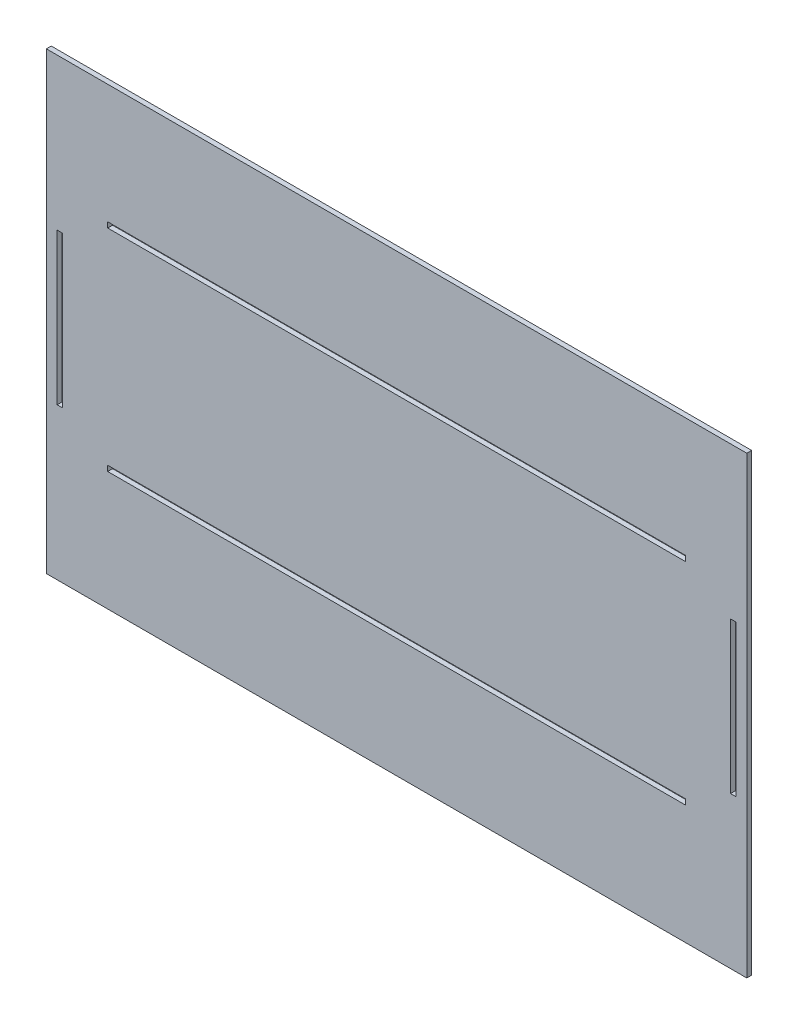
ISO-10303-21;
HEADER;
FILE_DESCRIPTION(('STEP AP214'),'2;1');
FILE_NAME('part.step','',(''),(''),'','','');
FILE_SCHEMA(('AUTOMOTIVE_DESIGN { 1 0 10303 214 1 1 1 1 }'));
ENDSEC;
DATA;
#1=APPLICATION_CONTEXT('core data for automotive mechanical design processes');
#2=APPLICATION_PROTOCOL_DEFINITION('international standard','automotive_design',2000,#1);
#3=PRODUCT_CONTEXT('',#1,'mechanical');
#4=PRODUCT('Part','Part','',(#3));
#5=PRODUCT_RELATED_PRODUCT_CATEGORY('part','',(#4));
#6=PRODUCT_DEFINITION_FORMATION('','',#4);
#7=PRODUCT_DEFINITION_CONTEXT('part definition',#1,'design');
#8=PRODUCT_DEFINITION('design','',#6,#7);
#9=PRODUCT_DEFINITION_SHAPE('','',#8);
#10=(LENGTH_UNIT() NAMED_UNIT(*) SI_UNIT(.MILLI.,.METRE.));
#11=(NAMED_UNIT(*) PLANE_ANGLE_UNIT() SI_UNIT($,.RADIAN.));
#12=(NAMED_UNIT(*) SI_UNIT($,.STERADIAN.) SOLID_ANGLE_UNIT());
#13=UNCERTAINTY_MEASURE_WITH_UNIT(LENGTH_MEASURE(1.E-05),#10,'distance_accuracy_value','');
#14=(GEOMETRIC_REPRESENTATION_CONTEXT(3) GLOBAL_UNCERTAINTY_ASSIGNED_CONTEXT((#13)) GLOBAL_UNIT_ASSIGNED_CONTEXT((#10,
#11,#12)) REPRESENTATION_CONTEXT('',''));
#15=CARTESIAN_POINT('',(0.,0.,0.));
#16=DIRECTION('',(0.,0.,1.));
#17=DIRECTION('',(1.,0.,0.));
#18=AXIS2_PLACEMENT_3D('',#15,#16,#17);
#19=CARTESIAN_POINT('',(313.36742,0.,2.286));
#20=DIRECTION('',(1.,0.,0.));
#21=DIRECTION('',(0.,0.,-1.));
#22=AXIS2_PLACEMENT_3D('',#19,#20,#21);
#23=PLANE('',#22);
#24=DIRECTION('',(0.,-1.,0.));
#25=VECTOR('',#24,1.);
#26=CARTESIAN_POINT('',(313.36742,0.,0.));
#27=LINE('',#26,#25);
#28=CARTESIAN_POINT('',(313.36742,83.6803,0.));
#29=VERTEX_POINT('',#28);
#30=CARTESIAN_POINT('',(313.36742,12.7,0.));
#31=VERTEX_POINT('',#30);
#32=EDGE_CURVE('E302',#29,#31,#27,.T.);
#33=ORIENTED_EDGE('',*,*,#32,.F.);
#34=DIRECTION('',(0.,0.,-1.));
#35=VECTOR('',#34,1.);
#36=CARTESIAN_POINT('',(313.36742,83.6803,2.286));
#37=LINE('',#36,#35);
#38=CARTESIAN_POINT('',(313.36742,83.6803,2.286));
#39=VERTEX_POINT('',#38);
#40=EDGE_CURVE('E11',#39,#29,#37,.T.);
#41=ORIENTED_EDGE('',*,*,#40,.F.);
#42=DIRECTION('',(0.,-1.,0.));
#43=VECTOR('',#42,1.);
#44=CARTESIAN_POINT('',(313.36742,0.,2.286));
#45=LINE('',#44,#43);
#46=CARTESIAN_POINT('',(313.36742,12.7,2.286));
#47=VERTEX_POINT('',#46);
#48=EDGE_CURVE('E182',#39,#47,#45,.T.);
#49=ORIENTED_EDGE('',*,*,#48,.T.);
#50=DIRECTION('',(0.,0.,-1.));
#51=VECTOR('',#50,1.);
#52=CARTESIAN_POINT('',(313.36742,12.7,2.286));
#53=LINE('',#52,#51);
#54=EDGE_CURVE('E120',#47,#31,#53,.T.);
#55=ORIENTED_EDGE('',*,*,#54,.T.);
#56=EDGE_LOOP('',(#33,#41,#49,#55));
#57=FACE_BOUND('',#56,.T.);
#58=ADVANCED_FACE('F41',(#57),#23,.T.);
#59=CARTESIAN_POINT('',(0.,83.6803,2.286));
#60=DIRECTION('',(0.,1.,0.));
#61=DIRECTION('',(0.,0.,1.));
#62=AXIS2_PLACEMENT_3D('',#59,#60,#61);
#63=PLANE('',#62);
#64=DIRECTION('',(1.,0.,0.));
#65=VECTOR('',#64,1.);
#66=CARTESIAN_POINT('',(0.,83.6803,0.));
#67=LINE('',#66,#65);
#68=CARTESIAN_POINT('',(315.90742,83.6803,0.));
#69=VERTEX_POINT('',#68);
#70=EDGE_CURVE('E188',#29,#69,#67,.T.);
#71=ORIENTED_EDGE('',*,*,#70,.T.);
#72=DIRECTION('',(0.,0.,-1.));
#73=VECTOR('',#72,1.);
#74=CARTESIAN_POINT('',(315.90742,83.6803,2.286));
#75=LINE('',#74,#73);
#76=CARTESIAN_POINT('',(315.90742,83.6803,2.286));
#77=VERTEX_POINT('',#76);
#78=EDGE_CURVE('E52',#77,#69,#75,.T.);
#79=ORIENTED_EDGE('',*,*,#78,.F.);
#80=DIRECTION('',(1.,0.,0.));
#81=VECTOR('',#80,1.);
#82=CARTESIAN_POINT('',(0.,83.6803,2.286));
#83=LINE('',#82,#81);
#84=EDGE_CURVE('E178',#39,#77,#83,.T.);
#85=ORIENTED_EDGE('',*,*,#84,.F.);
#86=ORIENTED_EDGE('',*,*,#40,.T.);
#87=EDGE_LOOP('',(#71,#79,#85,#86));
#88=FACE_BOUND('',#87,.T.);
#89=ADVANCED_FACE('F186',(#88),#63,.F.);
#90=CARTESIAN_POINT('',(315.90742,0.,2.286));
#91=DIRECTION('',(1.,0.,0.));
#92=DIRECTION('',(0.,0.,-1.));
#93=AXIS2_PLACEMENT_3D('',#90,#91,#92);
#94=PLANE('',#93);
#95=DIRECTION('',(0.,-1.,0.));
#96=VECTOR('',#95,1.);
#97=CARTESIAN_POINT('',(315.90742,0.,0.));
#98=LINE('',#97,#96);
#99=CARTESIAN_POINT('',(315.90742,12.7,0.));
#100=VERTEX_POINT('',#99);
#101=EDGE_CURVE('E307',#69,#100,#98,.T.);
#102=ORIENTED_EDGE('',*,*,#101,.T.);
#103=DIRECTION('',(0.,0.,-1.));
#104=VECTOR('',#103,1.);
#105=CARTESIAN_POINT('',(315.90742,12.7,2.286));
#106=LINE('',#105,#104);
#107=CARTESIAN_POINT('',(315.90742,12.7,2.286));
#108=VERTEX_POINT('',#107);
#109=EDGE_CURVE('E176',#108,#100,#106,.T.);
#110=ORIENTED_EDGE('',*,*,#109,.F.);
#111=DIRECTION('',(0.,-1.,0.));
#112=VECTOR('',#111,1.);
#113=CARTESIAN_POINT('',(315.90742,0.,2.286));
#114=LINE('',#113,#112);
#115=EDGE_CURVE('E170',#77,#108,#114,.T.);
#116=ORIENTED_EDGE('',*,*,#115,.F.);
#117=ORIENTED_EDGE('',*,*,#78,.T.);
#118=EDGE_LOOP('',(#102,#110,#116,#117));
#119=FACE_BOUND('',#118,.T.);
#120=ADVANCED_FACE('F173',(#119),#94,.F.);
#121=CARTESIAN_POINT('',(0.,98.9203,2.286));
#122=DIRECTION('',(0.,1.,0.));
#123=DIRECTION('',(0.,0.,1.));
#124=AXIS2_PLACEMENT_3D('',#121,#122,#123);
#125=PLANE('',#124);
#126=DIRECTION('',(1.,0.,0.));
#127=VECTOR('',#126,1.);
#128=CARTESIAN_POINT('',(0.,98.9203,0.));
#129=LINE('',#128,#127);
#130=CARTESIAN_POINT('',(21.166832765993,98.9203,0.));
#131=VERTEX_POINT('',#130);
#132=CARTESIAN_POINT('',(292.200587234007,98.9203,0.));
#133=VERTEX_POINT('',#132);
#134=EDGE_CURVE('E286',#131,#133,#129,.T.);
#135=ORIENTED_EDGE('',*,*,#134,.T.);
#136=DIRECTION('',(0.,0.,-1.));
#137=VECTOR('',#136,1.);
#138=CARTESIAN_POINT('',(292.200587234007,98.9203,2.286));
#139=LINE('',#138,#137);
#140=CARTESIAN_POINT('',(292.200587234007,98.9203,2.286));
#141=VERTEX_POINT('',#140);
#142=EDGE_CURVE('E205',#141,#133,#139,.T.);
#143=ORIENTED_EDGE('',*,*,#142,.F.);
#144=DIRECTION('',(1.,0.,0.));
#145=VECTOR('',#144,1.);
#146=CARTESIAN_POINT('',(0.,98.9203,2.286));
#147=LINE('',#146,#145);
#148=CARTESIAN_POINT('',(21.166832765993,98.9203,2.286));
#149=VERTEX_POINT('',#148);
#150=EDGE_CURVE('E351',#149,#141,#147,.T.);
#151=ORIENTED_EDGE('',*,*,#150,.F.);
#152=DIRECTION('',(0.,0.,-1.));
#153=VECTOR('',#152,1.);
#154=CARTESIAN_POINT('',(21.166832765993,98.9203,2.286));
#155=LINE('',#154,#153);
#156=EDGE_CURVE('E195',#149,#131,#155,.T.);
#157=ORIENTED_EDGE('',*,*,#156,.T.);
#158=EDGE_LOOP('',(#135,#143,#151,#157));
#159=FACE_BOUND('',#158,.T.);
#160=ADVANCED_FACE('F404',(#159),#125,.F.);
#161=CARTESIAN_POINT('',(292.200587234007,0.,2.286));
#162=DIRECTION('',(1.,0.,0.));
#163=DIRECTION('',(0.,0.,-1.));
#164=AXIS2_PLACEMENT_3D('',#161,#162,#163);
#165=PLANE('',#164);
#166=DIRECTION('',(0.,-1.,0.));
#167=VECTOR('',#166,1.);
#168=CARTESIAN_POINT('',(292.200587234007,0.,0.));
#169=LINE('',#168,#167);
#170=CARTESIAN_POINT('',(292.200587234007,96.3803,0.));
#171=VERTEX_POINT('',#170);
#172=EDGE_CURVE('E290',#133,#171,#169,.T.);
#173=ORIENTED_EDGE('',*,*,#172,.T.);
#174=DIRECTION('',(0.,0.,-1.));
#175=VECTOR('',#174,1.);
#176=CARTESIAN_POINT('',(292.200587234007,96.3803,2.286));
#177=LINE('',#176,#175);
#178=CARTESIAN_POINT('',(292.200587234007,96.3803,2.286));
#179=VERTEX_POINT('',#178);
#180=EDGE_CURVE('E202',#179,#171,#177,.T.);
#181=ORIENTED_EDGE('',*,*,#180,.F.);
#182=DIRECTION('',(0.,-1.,0.));
#183=VECTOR('',#182,1.);
#184=CARTESIAN_POINT('',(292.200587234007,0.,2.286));
#185=LINE('',#184,#183);
#186=EDGE_CURVE('E355',#141,#179,#185,.T.);
#187=ORIENTED_EDGE('',*,*,#186,.F.);
#188=ORIENTED_EDGE('',*,*,#142,.T.);
#189=EDGE_LOOP('',(#173,#181,#187,#188));
#190=FACE_BOUND('',#189,.T.);
#191=ADVANCED_FACE('F400',(#190),#165,.F.);
#192=CARTESIAN_POINT('',(0.,96.3803,2.286));
#193=DIRECTION('',(0.,1.,0.));
#194=DIRECTION('',(0.,0.,1.));
#195=AXIS2_PLACEMENT_3D('',#192,#193,#194);
#196=PLANE('',#195);
#197=DIRECTION('',(1.,0.,0.));
#198=VECTOR('',#197,1.);
#199=CARTESIAN_POINT('',(0.,96.3803,0.));
#200=LINE('',#199,#198);
#201=CARTESIAN_POINT('',(21.166832765993,96.3803,0.));
#202=VERTEX_POINT('',#201);
#203=EDGE_CURVE('E294',#202,#171,#200,.T.);
#204=ORIENTED_EDGE('',*,*,#203,.F.);
#205=DIRECTION('',(0.,0.,-1.));
#206=VECTOR('',#205,1.);
#207=CARTESIAN_POINT('',(21.166832765993,96.3803,2.286));
#208=LINE('',#207,#206);
#209=CARTESIAN_POINT('',(21.166832765993,96.3803,2.286));
#210=VERTEX_POINT('',#209);
#211=EDGE_CURVE('E198',#210,#202,#208,.T.);
#212=ORIENTED_EDGE('',*,*,#211,.F.);
#213=DIRECTION('',(1.,0.,0.));
#214=VECTOR('',#213,1.);
#215=CARTESIAN_POINT('',(0.,96.3803,2.286));
#216=LINE('',#215,#214);
#217=EDGE_CURVE('E358',#210,#179,#216,.T.);
#218=ORIENTED_EDGE('',*,*,#217,.T.);
#219=ORIENTED_EDGE('',*,*,#180,.T.);
#220=EDGE_LOOP('',(#204,#212,#218,#219));
#221=FACE_BOUND('',#220,.T.);
#222=ADVANCED_FACE('F396',(#221),#196,.T.);
#223=CARTESIAN_POINT('',(0.,0.,2.286));
#224=DIRECTION('',(0.,1.,0.));
#225=DIRECTION('',(0.,0.,1.));
#226=AXIS2_PLACEMENT_3D('',#223,#224,#225);
#227=PLANE('',#226);
#228=DIRECTION('',(1.,0.,0.));
#229=VECTOR('',#228,1.);
#230=CARTESIAN_POINT('',(0.,0.,0.));
#231=LINE('',#230,#229);
#232=CARTESIAN_POINT('',(21.166832765993,0.,0.));
#233=VERTEX_POINT('',#232);
#234=CARTESIAN_POINT('',(292.200587234007,0.,0.));
#235=VERTEX_POINT('',#234);
#236=EDGE_CURVE('E270',#233,#235,#231,.T.);
#237=ORIENTED_EDGE('',*,*,#236,.T.);
#238=DIRECTION('',(0.,0.,-1.));
#239=VECTOR('',#238,1.);
#240=CARTESIAN_POINT('',(292.200587234007,0.,2.286));
#241=LINE('',#240,#239);
#242=CARTESIAN_POINT('',(292.200587234007,0.,2.286));
#243=VERTEX_POINT('',#242);
#244=EDGE_CURVE('E199',#243,#235,#241,.T.);
#245=ORIENTED_EDGE('',*,*,#244,.F.);
#246=DIRECTION('',(1.,0.,0.));
#247=VECTOR('',#246,1.);
#248=CARTESIAN_POINT('',(0.,0.,2.286));
#249=LINE('',#248,#247);
#250=CARTESIAN_POINT('',(21.166832765993,0.,2.286));
#251=VERTEX_POINT('',#250);
#252=EDGE_CURVE('E336',#251,#243,#249,.T.);
#253=ORIENTED_EDGE('',*,*,#252,.F.);
#254=DIRECTION('',(0.,0.,-1.));
#255=VECTOR('',#254,1.);
#256=CARTESIAN_POINT('',(21.166832765993,0.,2.286));
#257=LINE('',#256,#255);
#258=EDGE_CURVE('E209',#251,#233,#257,.T.);
#259=ORIENTED_EDGE('',*,*,#258,.T.);
#260=EDGE_LOOP('',(#237,#245,#253,#259));
#261=FACE_BOUND('',#260,.T.);
#262=ADVANCED_FACE('F399',(#261),#227,.F.);
#263=CARTESIAN_POINT('',(292.200587234007,0.,2.286));
#264=DIRECTION('',(1.,0.,0.));
#265=DIRECTION('',(0.,0.,-1.));
#266=AXIS2_PLACEMENT_3D('',#263,#264,#265);
#267=PLANE('',#266);
#268=DIRECTION('',(0.,-1.,0.));
#269=VECTOR('',#268,1.);
#270=CARTESIAN_POINT('',(292.200587234007,0.,0.));
#271=LINE('',#270,#269);
#272=CARTESIAN_POINT('',(292.200587234007,-2.54,0.));
#273=VERTEX_POINT('',#272);
#274=EDGE_CURVE('E274',#235,#273,#271,.T.);
#275=ORIENTED_EDGE('',*,*,#274,.T.);
#276=DIRECTION('',(0.,0.,-1.));
#277=VECTOR('',#276,1.);
#278=CARTESIAN_POINT('',(292.200587234007,-2.54,2.286));
#279=LINE('',#278,#277);
#280=CARTESIAN_POINT('',(292.200587234007,-2.54,2.286));
#281=VERTEX_POINT('',#280);
#282=EDGE_CURVE('E215',#281,#273,#279,.T.);
#283=ORIENTED_EDGE('',*,*,#282,.F.);
#284=DIRECTION('',(0.,-1.,0.));
#285=VECTOR('',#284,1.);
#286=CARTESIAN_POINT('',(292.200587234007,0.,2.286));
#287=LINE('',#286,#285);
#288=EDGE_CURVE('E340',#243,#281,#287,.T.);
#289=ORIENTED_EDGE('',*,*,#288,.F.);
#290=ORIENTED_EDGE('',*,*,#244,.T.);
#291=EDGE_LOOP('',(#275,#283,#289,#290));
#292=FACE_BOUND('',#291,.T.);
#293=ADVANCED_FACE('F417',(#292),#267,.F.);
#294=CARTESIAN_POINT('',(0.,-2.54,2.286));
#295=DIRECTION('',(0.,1.,0.));
#296=DIRECTION('',(0.,0.,1.));
#297=AXIS2_PLACEMENT_3D('',#294,#295,#296);
#298=PLANE('',#297);
#299=DIRECTION('',(1.,0.,0.));
#300=VECTOR('',#299,1.);
#301=CARTESIAN_POINT('',(0.,-2.54,0.));
#302=LINE('',#301,#300);
#303=CARTESIAN_POINT('',(21.166832765993,-2.54,0.));
#304=VERTEX_POINT('',#303);
#305=EDGE_CURVE('E278',#304,#273,#302,.T.);
#306=ORIENTED_EDGE('',*,*,#305,.F.);
#307=DIRECTION('',(0.,0.,-1.));
#308=VECTOR('',#307,1.);
#309=CARTESIAN_POINT('',(21.166832765993,-2.54,2.286));
#310=LINE('',#309,#308);
#311=CARTESIAN_POINT('',(21.166832765993,-2.54,2.286));
#312=VERTEX_POINT('',#311);
#313=EDGE_CURVE('E212',#312,#304,#310,.T.);
#314=ORIENTED_EDGE('',*,*,#313,.F.);
#315=DIRECTION('',(1.,0.,0.));
#316=VECTOR('',#315,1.);
#317=CARTESIAN_POINT('',(0.,-2.54,2.286));
#318=LINE('',#317,#316);
#319=EDGE_CURVE('E343',#312,#281,#318,.T.);
#320=ORIENTED_EDGE('',*,*,#319,.T.);
#321=ORIENTED_EDGE('',*,*,#282,.T.);
#322=EDGE_LOOP('',(#306,#314,#320,#321));
#323=FACE_BOUND('',#322,.T.);
#324=ADVANCED_FACE('F413',(#323),#298,.T.);
#325=CARTESIAN_POINT('',(-7.62,0.,2.286));
#326=DIRECTION('',(-1.,0.,0.));
#327=DIRECTION('',(0.,0.,1.));
#328=AXIS2_PLACEMENT_3D('',#325,#326,#327);
#329=PLANE('',#328);
#330=DIRECTION('',(0.,1.,0.));
#331=VECTOR('',#330,1.);
#332=CARTESIAN_POINT('',(-7.62,0.,0.));
#333=LINE('',#332,#331);
#334=CARTESIAN_POINT('',(-7.61999999999998,-58.42,0.));
#335=VERTEX_POINT('',#334);
#336=CARTESIAN_POINT('',(-7.62,154.8003,0.));
#337=VERTEX_POINT('',#336);
#338=EDGE_CURVE('E262',#335,#337,#333,.T.);
#339=ORIENTED_EDGE('',*,*,#338,.F.);
#340=DIRECTION('',(0.,0.,1.));
#341=VECTOR('',#340,1.);
#342=CARTESIAN_POINT('',(-7.61999999999998,-58.42,0.));
#343=LINE('',#342,#341);
#344=CARTESIAN_POINT('',(-7.61999999999998,-58.42,2.286));
#345=VERTEX_POINT('',#344);
#346=EDGE_CURVE('E598',#335,#345,#343,.T.);
#347=ORIENTED_EDGE('',*,*,#346,.T.);
#348=DIRECTION('',(0.,1.,0.));
#349=VECTOR('',#348,1.);
#350=CARTESIAN_POINT('',(-7.62,0.,2.286));
#351=LINE('',#350,#349);
#352=CARTESIAN_POINT('',(-7.62,154.8003,2.286));
#353=VERTEX_POINT('',#352);
#354=EDGE_CURVE('E328',#345,#353,#351,.T.);
#355=ORIENTED_EDGE('',*,*,#354,.T.);
#356=DIRECTION('',(0.,0.,1.));
#357=VECTOR('',#356,1.);
#358=CARTESIAN_POINT('',(-7.62,154.8003,0.));
#359=LINE('',#358,#357);
#360=EDGE_CURVE('E248',#337,#353,#359,.T.);
#361=ORIENTED_EDGE('',*,*,#360,.F.);
#362=EDGE_LOOP('',(#339,#347,#355,#361));
#363=FACE_BOUND('',#362,.T.);
#364=ADVANCED_FACE('F416',(#363),#329,.T.);
#365=CARTESIAN_POINT('',(320.98742,0.,2.286));
#366=DIRECTION('',(-1.,0.,0.));
#367=DIRECTION('',(0.,0.,1.));
#368=AXIS2_PLACEMENT_3D('',#365,#366,#367);
#369=PLANE('',#368);
#370=DIRECTION('',(0.,1.,0.));
#371=VECTOR('',#370,1.);
#372=CARTESIAN_POINT('',(320.98742,0.,0.));
#373=LINE('',#372,#371);
#374=CARTESIAN_POINT('',(320.98742,-58.42,0.));
#375=VERTEX_POINT('',#374);
#376=CARTESIAN_POINT('',(320.98742,154.8003,0.));
#377=VERTEX_POINT('',#376);
#378=EDGE_CURVE('E266',#375,#377,#373,.T.);
#379=ORIENTED_EDGE('',*,*,#378,.T.);
#380=DIRECTION('',(0.,0.,1.));
#381=VECTOR('',#380,1.);
#382=CARTESIAN_POINT('',(320.98742,154.8003,0.));
#383=LINE('',#382,#381);
#384=CARTESIAN_POINT('',(320.98742,154.8003,2.286));
#385=VERTEX_POINT('',#384);
#386=EDGE_CURVE('E320',#377,#385,#383,.T.);
#387=ORIENTED_EDGE('',*,*,#386,.T.);
#388=DIRECTION('',(0.,1.,0.));
#389=VECTOR('',#388,1.);
#390=CARTESIAN_POINT('',(320.98742,0.,2.286));
#391=LINE('',#390,#389);
#392=CARTESIAN_POINT('',(320.98742,-58.42,2.286));
#393=VERTEX_POINT('',#392);
#394=EDGE_CURVE('E332',#393,#385,#391,.T.);
#395=ORIENTED_EDGE('',*,*,#394,.F.);
#396=DIRECTION('',(0.,0.,1.));
#397=VECTOR('',#396,1.);
#398=CARTESIAN_POINT('',(320.98742,-58.42,0.));
#399=LINE('',#398,#397);
#400=EDGE_CURVE('E602',#375,#393,#399,.T.);
#401=ORIENTED_EDGE('',*,*,#400,.F.);
#402=EDGE_LOOP('',(#379,#387,#395,#401));
#403=FACE_BOUND('',#402,.T.);
#404=ADVANCED_FACE('F425',(#403),#369,.F.);
#405=CARTESIAN_POINT('',(0.,12.7,2.286));
#406=DIRECTION('',(0.,1.,0.));
#407=DIRECTION('',(-1.,0.,0.));
#408=AXIS2_PLACEMENT_3D('',#405,#406,#407);
#409=PLANE('',#408);
#410=DIRECTION('',(1.,0.,0.));
#411=VECTOR('',#410,1.);
#412=CARTESIAN_POINT('',(0.,12.7,0.));
#413=LINE('',#412,#411);
#414=CARTESIAN_POINT('',(-2.53999999999999,12.7,0.));
#415=VERTEX_POINT('',#414);
#416=CARTESIAN_POINT('',(0.,12.7,0.));
#417=VERTEX_POINT('',#416);
#418=EDGE_CURVE('E242',#415,#417,#413,.T.);
#419=ORIENTED_EDGE('',*,*,#418,.F.);
#420=DIRECTION('',(0.,0.,-1.));
#421=VECTOR('',#420,1.);
#422=CARTESIAN_POINT('',(-2.53999999999999,12.7,2.286));
#423=LINE('',#422,#421);
#424=CARTESIAN_POINT('',(-2.53999999999999,12.7,2.286));
#425=VERTEX_POINT('',#424);
#426=EDGE_CURVE('E45',#425,#415,#423,.T.);
#427=ORIENTED_EDGE('',*,*,#426,.F.);
#428=DIRECTION('',(1.,0.,0.));
#429=VECTOR('',#428,1.);
#430=CARTESIAN_POINT('',(0.,12.7,2.286));
#431=LINE('',#430,#429);
#432=CARTESIAN_POINT('',(0.,12.7,2.286));
#433=VERTEX_POINT('',#432);
#434=EDGE_CURVE('E311',#425,#433,#431,.T.);
#435=ORIENTED_EDGE('',*,*,#434,.T.);
#436=DIRECTION('',(0.,0.,-1.));
#437=VECTOR('',#436,1.);
#438=CARTESIAN_POINT('',(0.,12.7,2.286));
#439=LINE('',#438,#437);
#440=EDGE_CURVE('E221',#433,#417,#439,.T.);
#441=ORIENTED_EDGE('',*,*,#440,.T.);
#442=EDGE_LOOP('',(#419,#427,#435,#441));
#443=FACE_BOUND('',#442,.T.);
#444=ADVANCED_FACE('F43',(#443),#409,.T.);
#445=CARTESIAN_POINT('',(-2.53999999999999,0.,2.286));
#446=DIRECTION('',(1.,0.,0.));
#447=DIRECTION('',(0.,1.,0.));
#448=AXIS2_PLACEMENT_3D('',#445,#446,#447);
#449=PLANE('',#448);
#450=DIRECTION('',(0.,-1.,0.));
#451=VECTOR('',#450,1.);
#452=CARTESIAN_POINT('',(-2.53999999999999,0.,0.));
#453=LINE('',#452,#451);
#454=CARTESIAN_POINT('',(-2.54,83.6803,0.));
#455=VERTEX_POINT('',#454);
#456=EDGE_CURVE('E237',#455,#415,#453,.T.);
#457=ORIENTED_EDGE('',*,*,#456,.F.);
#458=DIRECTION('',(0.,0.,-1.));
#459=VECTOR('',#458,1.);
#460=CARTESIAN_POINT('',(-2.54,83.6803,2.286));
#461=LINE('',#460,#459);
#462=CARTESIAN_POINT('',(-2.54,83.6803,2.286));
#463=VERTEX_POINT('',#462);
#464=EDGE_CURVE('E226',#463,#455,#461,.T.);
#465=ORIENTED_EDGE('',*,*,#464,.F.);
#466=DIRECTION('',(0.,-1.,0.));
#467=VECTOR('',#466,1.);
#468=CARTESIAN_POINT('',(-2.53999999999999,0.,2.286));
#469=LINE('',#468,#467);
#470=EDGE_CURVE('E240',#463,#425,#469,.T.);
#471=ORIENTED_EDGE('',*,*,#470,.T.);
#472=ORIENTED_EDGE('',*,*,#426,.T.);
#473=EDGE_LOOP('',(#457,#465,#471,#472));
#474=FACE_BOUND('',#473,.T.);
#475=ADVANCED_FACE('F235',(#474),#449,.T.);
#476=CARTESIAN_POINT('',(0.,83.6803,2.286));
#477=DIRECTION('',(0.,-1.,0.));
#478=DIRECTION('',(0.,0.,-1.));
#479=AXIS2_PLACEMENT_3D('',#476,#477,#478);
#480=PLANE('',#479);
#481=DIRECTION('',(-1.,0.,0.));
#482=VECTOR('',#481,1.);
#483=CARTESIAN_POINT('',(0.,83.6803,0.));
#484=LINE('',#483,#482);
#485=CARTESIAN_POINT('',(0.,83.6803,0.));
#486=VERTEX_POINT('',#485);
#487=EDGE_CURVE('E252',#486,#455,#484,.T.);
#488=ORIENTED_EDGE('',*,*,#487,.F.);
#489=DIRECTION('',(0.,0.,-1.));
#490=VECTOR('',#489,1.);
#491=CARTESIAN_POINT('',(0.,83.6803,2.286));
#492=LINE('',#491,#490);
#493=CARTESIAN_POINT('',(0.,83.6803,2.286));
#494=VERTEX_POINT('',#493);
#495=EDGE_CURVE('E224',#494,#486,#492,.T.);
#496=ORIENTED_EDGE('',*,*,#495,.F.);
#497=DIRECTION('',(-1.,0.,0.));
#498=VECTOR('',#497,1.);
#499=CARTESIAN_POINT('',(0.,83.6803,2.286));
#500=LINE('',#499,#498);
#501=EDGE_CURVE('E317',#494,#463,#500,.T.);
#502=ORIENTED_EDGE('',*,*,#501,.T.);
#503=ORIENTED_EDGE('',*,*,#464,.T.);
#504=EDGE_LOOP('',(#488,#496,#502,#503));
#505=FACE_BOUND('',#504,.T.);
#506=ADVANCED_FACE('F394',(#505),#480,.T.);
#507=CARTESIAN_POINT('',(21.166832765993,0.,2.286));
#508=DIRECTION('',(1.,0.,0.));
#509=DIRECTION('',(0.,0.,-1.));
#510=AXIS2_PLACEMENT_3D('',#507,#508,#509);
#511=PLANE('',#510);
#512=DIRECTION('',(0.,-1.,0.));
#513=VECTOR('',#512,1.);
#514=CARTESIAN_POINT('',(21.166832765993,0.,0.));
#515=LINE('',#514,#513);
#516=EDGE_CURVE('E298',#131,#202,#515,.T.);
#517=ORIENTED_EDGE('',*,*,#516,.F.);
#518=ORIENTED_EDGE('',*,*,#156,.F.);
#519=DIRECTION('',(0.,-1.,0.));
#520=VECTOR('',#519,1.);
#521=CARTESIAN_POINT('',(21.166832765993,0.,2.286));
#522=LINE('',#521,#520);
#523=EDGE_CURVE('E362',#149,#210,#522,.T.);
#524=ORIENTED_EDGE('',*,*,#523,.T.);
#525=ORIENTED_EDGE('',*,*,#211,.T.);
#526=EDGE_LOOP('',(#517,#518,#524,#525));
#527=FACE_BOUND('',#526,.T.);
#528=ADVANCED_FACE('F390',(#527),#511,.T.);
#529=CARTESIAN_POINT('',(21.166832765993,0.,2.286));
#530=DIRECTION('',(1.,0.,0.));
#531=DIRECTION('',(0.,0.,-1.));
#532=AXIS2_PLACEMENT_3D('',#529,#530,#531);
#533=PLANE('',#532);
#534=DIRECTION('',(0.,-1.,0.));
#535=VECTOR('',#534,1.);
#536=CARTESIAN_POINT('',(21.166832765993,0.,0.));
#537=LINE('',#536,#535);
#538=EDGE_CURVE('E282',#233,#304,#537,.T.);
#539=ORIENTED_EDGE('',*,*,#538,.F.);
#540=ORIENTED_EDGE('',*,*,#258,.F.);
#541=DIRECTION('',(0.,-1.,0.));
#542=VECTOR('',#541,1.);
#543=CARTESIAN_POINT('',(21.166832765993,0.,2.286));
#544=LINE('',#543,#542);
#545=EDGE_CURVE('E347',#251,#312,#544,.T.);
#546=ORIENTED_EDGE('',*,*,#545,.T.);
#547=ORIENTED_EDGE('',*,*,#313,.T.);
#548=EDGE_LOOP('',(#539,#540,#546,#547));
#549=FACE_BOUND('',#548,.T.);
#550=ADVANCED_FACE('F393',(#549),#533,.T.);
#551=CARTESIAN_POINT('',(0.,0.,2.286));
#552=DIRECTION('',(1.,0.,0.));
#553=DIRECTION('',(0.,1.,0.));
#554=AXIS2_PLACEMENT_3D('',#551,#552,#553);
#555=PLANE('',#554);
#556=DIRECTION('',(0.,-1.,0.));
#557=VECTOR('',#556,1.);
#558=CARTESIAN_POINT('',(0.,0.,0.));
#559=LINE('',#558,#557);
#560=EDGE_CURVE('E256',#486,#417,#559,.T.);
#561=ORIENTED_EDGE('',*,*,#560,.T.);
#562=ORIENTED_EDGE('',*,*,#440,.F.);
#563=DIRECTION('',(0.,-1.,0.));
#564=VECTOR('',#563,1.);
#565=CARTESIAN_POINT('',(0.,0.,2.286));
#566=LINE('',#565,#564);
#567=EDGE_CURVE('E325',#494,#433,#566,.T.);
#568=ORIENTED_EDGE('',*,*,#567,.F.);
#569=ORIENTED_EDGE('',*,*,#495,.T.);
#570=EDGE_LOOP('',(#561,#562,#568,#569));
#571=FACE_BOUND('',#570,.T.);
#572=ADVANCED_FACE('F411',(#571),#555,.F.);
#573=CARTESIAN_POINT('',(0.,12.7000000000002,2.286));
#574=DIRECTION('',(0.,-1.,0.));
#575=DIRECTION('',(1.,0.,0.));
#576=AXIS2_PLACEMENT_3D('',#573,#574,#575);
#577=PLANE('',#576);
#578=DIRECTION('',(-1.,0.,0.));
#579=VECTOR('',#578,1.);
#580=CARTESIAN_POINT('',(0.,12.7000000000002,0.));
#581=LINE('',#580,#579);
#582=EDGE_CURVE('E113',#100,#31,#581,.T.);
#583=ORIENTED_EDGE('',*,*,#582,.T.);
#584=ORIENTED_EDGE('',*,*,#54,.F.);
#585=DIRECTION('',(-1.,0.,0.));
#586=VECTOR('',#585,1.);
#587=CARTESIAN_POINT('',(0.,12.7000000000002,2.286));
#588=LINE('',#587,#586);
#589=EDGE_CURVE('E61',#108,#47,#588,.T.);
#590=ORIENTED_EDGE('',*,*,#589,.F.);
#591=ORIENTED_EDGE('',*,*,#109,.T.);
#592=EDGE_LOOP('',(#583,#584,#590,#591));
#593=FACE_BOUND('',#592,.T.);
#594=ADVANCED_FACE('F378',(#593),#577,.F.);
#595=CARTESIAN_POINT('',(0.,0.,2.286));
#596=DIRECTION('',(0.,0.,1.));
#597=DIRECTION('',(1.,0.,0.));
#598=AXIS2_PLACEMENT_3D('',#595,#596,#597);
#599=PLANE('',#598);
#600=ORIENTED_EDGE('',*,*,#434,.F.);
#601=ORIENTED_EDGE('',*,*,#470,.F.);
#602=ORIENTED_EDGE('',*,*,#501,.F.);
#603=ORIENTED_EDGE('',*,*,#567,.T.);
#604=EDGE_LOOP('',(#600,#601,#602,#603));
#605=FACE_BOUND('',#604,.T.);
#606=ORIENTED_EDGE('',*,*,#354,.F.);
#607=DIRECTION('',(1.,0.,0.));
#608=VECTOR('',#607,1.);
#609=CARTESIAN_POINT('',(-7.61999999999998,-58.42,2.286));
#610=LINE('',#609,#608);
#611=EDGE_CURVE('E594',#345,#393,#610,.T.);
#612=ORIENTED_EDGE('',*,*,#611,.T.);
#613=ORIENTED_EDGE('',*,*,#394,.T.);
#614=DIRECTION('',(-1.,0.,0.));
#615=VECTOR('',#614,1.);
#616=CARTESIAN_POINT('',(-7.62,154.8003,2.286));
#617=LINE('',#616,#615);
#618=EDGE_CURVE('E614',#385,#353,#617,.T.);
#619=ORIENTED_EDGE('',*,*,#618,.T.);
#620=EDGE_LOOP('',(#606,#612,#613,#619));
#621=FACE_BOUND('',#620,.T.);
#622=ORIENTED_EDGE('',*,*,#252,.T.);
#623=ORIENTED_EDGE('',*,*,#288,.T.);
#624=ORIENTED_EDGE('',*,*,#319,.F.);
#625=ORIENTED_EDGE('',*,*,#545,.F.);
#626=EDGE_LOOP('',(#622,#623,#624,#625));
#627=FACE_BOUND('',#626,.T.);
#628=ORIENTED_EDGE('',*,*,#150,.T.);
#629=ORIENTED_EDGE('',*,*,#186,.T.);
#630=ORIENTED_EDGE('',*,*,#217,.F.);
#631=ORIENTED_EDGE('',*,*,#523,.F.);
#632=EDGE_LOOP('',(#628,#629,#630,#631));
#633=FACE_BOUND('',#632,.T.);
#634=ORIENTED_EDGE('',*,*,#48,.F.);
#635=ORIENTED_EDGE('',*,*,#84,.T.);
#636=ORIENTED_EDGE('',*,*,#115,.T.);
#637=ORIENTED_EDGE('',*,*,#589,.T.);
#638=EDGE_LOOP('',(#634,#635,#636,#637));
#639=FACE_BOUND('',#638,.T.);
#640=ADVANCED_FACE('F181',(#605,#621,#627,#633,#639),#599,.T.);
#641=CARTESIAN_POINT('',(0.,0.,0.));
#642=DIRECTION('',(0.,0.,1.));
#643=DIRECTION('',(1.,0.,0.));
#644=AXIS2_PLACEMENT_3D('',#641,#642,#643);
#645=PLANE('',#644);
#646=ORIENTED_EDGE('',*,*,#418,.T.);
#647=ORIENTED_EDGE('',*,*,#560,.F.);
#648=ORIENTED_EDGE('',*,*,#487,.T.);
#649=ORIENTED_EDGE('',*,*,#456,.T.);
#650=EDGE_LOOP('',(#646,#647,#648,#649));
#651=FACE_BOUND('',#650,.T.);
#652=ORIENTED_EDGE('',*,*,#338,.T.);
#653=DIRECTION('',(-1.,0.,0.));
#654=VECTOR('',#653,1.);
#655=CARTESIAN_POINT('',(-7.62,154.8003,0.));
#656=LINE('',#655,#654);
#657=EDGE_CURVE('E617',#377,#337,#656,.T.);
#658=ORIENTED_EDGE('',*,*,#657,.F.);
#659=ORIENTED_EDGE('',*,*,#378,.F.);
#660=DIRECTION('',(1.,0.,0.));
#661=VECTOR('',#660,1.);
#662=CARTESIAN_POINT('',(-7.61999999999998,-58.42,0.));
#663=LINE('',#662,#661);
#664=EDGE_CURVE('E607',#335,#375,#663,.T.);
#665=ORIENTED_EDGE('',*,*,#664,.F.);
#666=EDGE_LOOP('',(#652,#658,#659,#665));
#667=FACE_BOUND('',#666,.T.);
#668=ORIENTED_EDGE('',*,*,#236,.F.);
#669=ORIENTED_EDGE('',*,*,#538,.T.);
#670=ORIENTED_EDGE('',*,*,#305,.T.);
#671=ORIENTED_EDGE('',*,*,#274,.F.);
#672=EDGE_LOOP('',(#668,#669,#670,#671));
#673=FACE_BOUND('',#672,.T.);
#674=ORIENTED_EDGE('',*,*,#134,.F.);
#675=ORIENTED_EDGE('',*,*,#516,.T.);
#676=ORIENTED_EDGE('',*,*,#203,.T.);
#677=ORIENTED_EDGE('',*,*,#172,.F.);
#678=EDGE_LOOP('',(#674,#675,#676,#677));
#679=FACE_BOUND('',#678,.T.);
#680=ORIENTED_EDGE('',*,*,#32,.T.);
#681=ORIENTED_EDGE('',*,*,#582,.F.);
#682=ORIENTED_EDGE('',*,*,#101,.F.);
#683=ORIENTED_EDGE('',*,*,#70,.F.);
#684=EDGE_LOOP('',(#680,#681,#682,#683));
#685=FACE_BOUND('',#684,.T.);
#686=ADVANCED_FACE('F250',(#651,#667,#673,#679,#685),#645,.F.);
#687=CARTESIAN_POINT('',(-7.62,154.8003,0.));
#688=DIRECTION('',(0.,1.,0.));
#689=DIRECTION('',(0.,0.,1.));
#690=AXIS2_PLACEMENT_3D('',#687,#688,#689);
#691=PLANE('',#690);
#692=ORIENTED_EDGE('',*,*,#618,.F.);
#693=ORIENTED_EDGE('',*,*,#386,.F.);
#694=ORIENTED_EDGE('',*,*,#657,.T.);
#695=ORIENTED_EDGE('',*,*,#360,.T.);
#696=EDGE_LOOP('',(#692,#693,#694,#695));
#697=FACE_BOUND('',#696,.T.);
#698=ADVANCED_FACE('F369',(#697),#691,.T.);
#699=CARTESIAN_POINT('',(-7.61999999999998,-58.42,0.));
#700=DIRECTION('',(0.,-1.,0.));
#701=DIRECTION('',(0.,0.,-1.));
#702=AXIS2_PLACEMENT_3D('',#699,#700,#701);
#703=PLANE('',#702);
#704=ORIENTED_EDGE('',*,*,#611,.F.);
#705=ORIENTED_EDGE('',*,*,#346,.F.);
#706=ORIENTED_EDGE('',*,*,#664,.T.);
#707=ORIENTED_EDGE('',*,*,#400,.T.);
#708=EDGE_LOOP('',(#704,#705,#706,#707));
#709=FACE_BOUND('',#708,.T.);
#710=ADVANCED_FACE('F375',(#709),#703,.T.);
#711=CLOSED_SHELL('',(#58,#89,#120,#160,#191,#222,#262,#293,#324,#364,#404,#444,#475,#506,#528,
#550,#572,#594,#640,#686,#698,#710));
#712=MANIFOLD_SOLID_BREP('B2',#711);
#713=ADVANCED_BREP_SHAPE_REPRESENTATION('',(#18,#712),#14);
#714=SHAPE_DEFINITION_REPRESENTATION(#9,#713);
ENDSEC;
END-ISO-10303-21;
